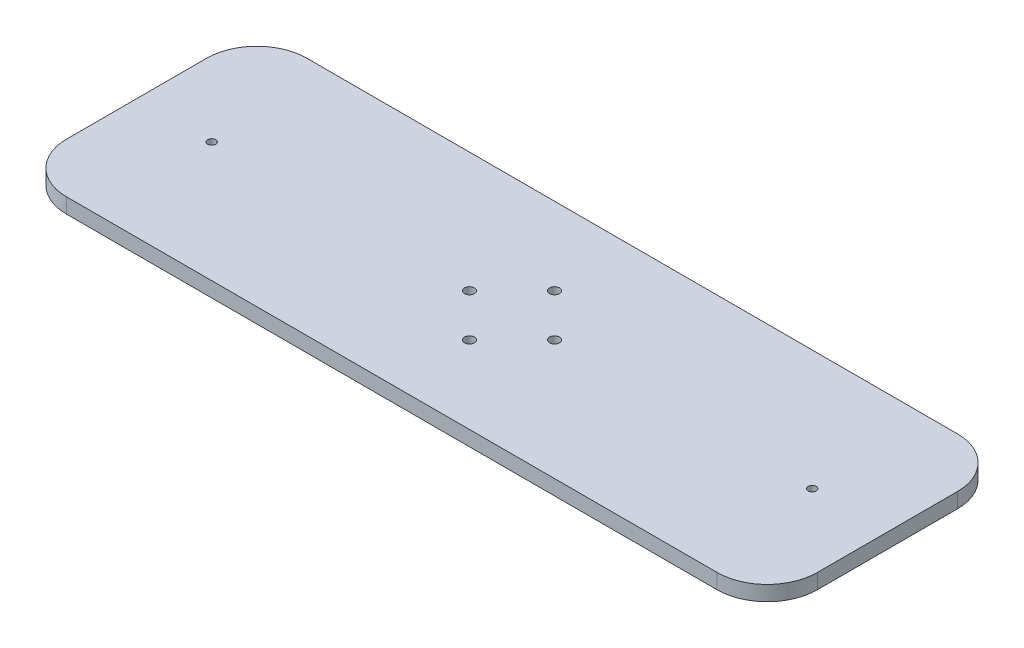
ISO-10303-21;
HEADER;
FILE_DESCRIPTION(('STEP AP214'),'2;1');
FILE_NAME('part.step','',(''),(''),'','','');
FILE_SCHEMA(('AUTOMOTIVE_DESIGN { 1 0 10303 214 1 1 1 1 }'));
ENDSEC;
DATA;
#1=APPLICATION_CONTEXT('core data for automotive mechanical design processes');
#2=APPLICATION_PROTOCOL_DEFINITION('international standard','automotive_design',2000,#1);
#3=PRODUCT_CONTEXT('',#1,'mechanical');
#4=PRODUCT('Part','Part','',(#3));
#5=PRODUCT_RELATED_PRODUCT_CATEGORY('part','',(#4));
#6=PRODUCT_DEFINITION_FORMATION('','',#4);
#7=PRODUCT_DEFINITION_CONTEXT('part definition',#1,'design');
#8=PRODUCT_DEFINITION('design','',#6,#7);
#9=PRODUCT_DEFINITION_SHAPE('','',#8);
#10=(LENGTH_UNIT() NAMED_UNIT(*) SI_UNIT(.MILLI.,.METRE.));
#11=(NAMED_UNIT(*) PLANE_ANGLE_UNIT() SI_UNIT($,.RADIAN.));
#12=(NAMED_UNIT(*) SI_UNIT($,.STERADIAN.) SOLID_ANGLE_UNIT());
#13=UNCERTAINTY_MEASURE_WITH_UNIT(LENGTH_MEASURE(1.E-05),#10,'distance_accuracy_value','');
#14=(GEOMETRIC_REPRESENTATION_CONTEXT(3) GLOBAL_UNCERTAINTY_ASSIGNED_CONTEXT((#13)) GLOBAL_UNIT_ASSIGNED_CONTEXT((#10,
#11,#12)) REPRESENTATION_CONTEXT('',''));
#15=CARTESIAN_POINT('',(0.,0.,0.));
#16=DIRECTION('',(0.,0.,1.));
#17=DIRECTION('',(1.,0.,0.));
#18=AXIS2_PLACEMENT_3D('',#15,#16,#17);
#19=CARTESIAN_POINT('',(-75.,3.,-24.));
#20=DIRECTION('',(1.,0.,0.));
#21=DIRECTION('',(0.,0.,-1.));
#22=AXIS2_PLACEMENT_3D('',#19,#20,#21);
#23=PLANE('',#22);
#24=DIRECTION('',(0.,0.,1.));
#25=VECTOR('',#24,1.);
#26=CARTESIAN_POINT('',(-75.,3.,-24.));
#27=LINE('',#26,#25);
#28=CARTESIAN_POINT('',(-75.,3.,-14.));
#29=VERTEX_POINT('',#28);
#30=CARTESIAN_POINT('',(-75.,3.,14.));
#31=VERTEX_POINT('',#30);
#32=EDGE_CURVE('E127',#29,#31,#27,.T.);
#33=ORIENTED_EDGE('',*,*,#32,.F.);
#34=DIRECTION('',(0.,-1.,0.));
#35=VECTOR('',#34,1.);
#36=CARTESIAN_POINT('',(-75.,3.,-14.));
#37=LINE('',#36,#35);
#38=CARTESIAN_POINT('',(-75.,0.,-14.));
#39=VERTEX_POINT('',#38);
#40=EDGE_CURVE('E11',#29,#39,#37,.T.);
#41=ORIENTED_EDGE('',*,*,#40,.T.);
#42=DIRECTION('',(0.,0.,1.));
#43=VECTOR('',#42,1.);
#44=CARTESIAN_POINT('',(-75.,0.,-24.));
#45=LINE('',#44,#43);
#46=CARTESIAN_POINT('',(-75.,0.,14.));
#47=VERTEX_POINT('',#46);
#48=EDGE_CURVE('E158',#39,#47,#45,.T.);
#49=ORIENTED_EDGE('',*,*,#48,.T.);
#50=DIRECTION('',(0.,-1.,0.));
#51=VECTOR('',#50,1.);
#52=CARTESIAN_POINT('',(-75.,3.,14.));
#53=LINE('',#52,#51);
#54=EDGE_CURVE('E41',#47,#31,#53,.F.);
#55=ORIENTED_EDGE('',*,*,#54,.T.);
#56=EDGE_LOOP('',(#33,#41,#49,#55));
#57=FACE_BOUND('',#56,.T.);
#58=ADVANCED_FACE('F33',(#57),#23,.F.);
#59=CARTESIAN_POINT('',(-75.,3.,24.));
#60=DIRECTION('',(0.,0.,-1.));
#61=DIRECTION('',(-1.,0.,0.));
#62=AXIS2_PLACEMENT_3D('',#59,#60,#61);
#63=PLANE('',#62);
#64=DIRECTION('',(1.,0.,0.));
#65=VECTOR('',#64,1.);
#66=CARTESIAN_POINT('',(-75.,0.,24.));
#67=LINE('',#66,#65);
#68=CARTESIAN_POINT('',(-65.,0.,24.));
#69=VERTEX_POINT('',#68);
#70=CARTESIAN_POINT('',(65.,0.,24.));
#71=VERTEX_POINT('',#70);
#72=EDGE_CURVE('E132',#69,#71,#67,.T.);
#73=ORIENTED_EDGE('',*,*,#72,.T.);
#74=DIRECTION('',(0.,-1.,0.));
#75=VECTOR('',#74,1.);
#76=CARTESIAN_POINT('',(65.,3.,24.));
#77=LINE('',#76,#75);
#78=CARTESIAN_POINT('',(65.,3.,24.));
#79=VERTEX_POINT('',#78);
#80=EDGE_CURVE('E48',#71,#79,#77,.F.);
#81=ORIENTED_EDGE('',*,*,#80,.T.);
#82=DIRECTION('',(1.,0.,0.));
#83=VECTOR('',#82,1.);
#84=CARTESIAN_POINT('',(-75.,3.,24.));
#85=LINE('',#84,#83);
#86=CARTESIAN_POINT('',(-65.,3.,24.));
#87=VERTEX_POINT('',#86);
#88=EDGE_CURVE('E130',#87,#79,#85,.T.);
#89=ORIENTED_EDGE('',*,*,#88,.F.);
#90=DIRECTION('',(0.,-1.,0.));
#91=VECTOR('',#90,1.);
#92=CARTESIAN_POINT('',(-65.,3.,24.));
#93=LINE('',#92,#91);
#94=EDGE_CURVE('E150',#87,#69,#93,.T.);
#95=ORIENTED_EDGE('',*,*,#94,.T.);
#96=EDGE_LOOP('',(#73,#81,#89,#95));
#97=FACE_BOUND('',#96,.T.);
#98=ADVANCED_FACE('F165',(#97),#63,.F.);
#99=CARTESIAN_POINT('',(75.,3.,-24.));
#100=DIRECTION('',(-1.,0.,0.));
#101=DIRECTION('',(0.,0.,1.));
#102=AXIS2_PLACEMENT_3D('',#99,#100,#101);
#103=PLANE('',#102);
#104=DIRECTION('',(0.,0.,-1.));
#105=VECTOR('',#104,1.);
#106=CARTESIAN_POINT('',(75.,0.,-24.));
#107=LINE('',#106,#105);
#108=CARTESIAN_POINT('',(75.,0.,14.));
#109=VERTEX_POINT('',#108);
#110=CARTESIAN_POINT('',(75.,0.,-14.));
#111=VERTEX_POINT('',#110);
#112=EDGE_CURVE('E128',#109,#111,#107,.T.);
#113=ORIENTED_EDGE('',*,*,#112,.T.);
#114=DIRECTION('',(0.,-1.,0.));
#115=VECTOR('',#114,1.);
#116=CARTESIAN_POINT('',(75.,3.,-14.));
#117=LINE('',#116,#115);
#118=CARTESIAN_POINT('',(75.,3.,-14.));
#119=VERTEX_POINT('',#118);
#120=EDGE_CURVE('E105',#111,#119,#117,.F.);
#121=ORIENTED_EDGE('',*,*,#120,.T.);
#122=DIRECTION('',(0.,0.,-1.));
#123=VECTOR('',#122,1.);
#124=CARTESIAN_POINT('',(75.,3.,-24.));
#125=LINE('',#124,#123);
#126=CARTESIAN_POINT('',(75.,3.,14.));
#127=VERTEX_POINT('',#126);
#128=EDGE_CURVE('E170',#127,#119,#125,.T.);
#129=ORIENTED_EDGE('',*,*,#128,.F.);
#130=DIRECTION('',(0.,-1.,0.));
#131=VECTOR('',#130,1.);
#132=CARTESIAN_POINT('',(75.,3.,14.));
#133=LINE('',#132,#131);
#134=EDGE_CURVE('E110',#127,#109,#133,.T.);
#135=ORIENTED_EDGE('',*,*,#134,.T.);
#136=EDGE_LOOP('',(#113,#121,#129,#135));
#137=FACE_BOUND('',#136,.T.);
#138=ADVANCED_FACE('F250',(#137),#103,.F.);
#139=CARTESIAN_POINT('',(-75.,3.,-24.));
#140=DIRECTION('',(0.,0.,1.));
#141=DIRECTION('',(1.,0.,0.));
#142=AXIS2_PLACEMENT_3D('',#139,#140,#141);
#143=PLANE('',#142);
#144=DIRECTION('',(-1.,0.,0.));
#145=VECTOR('',#144,1.);
#146=CARTESIAN_POINT('',(-75.,3.,-24.));
#147=LINE('',#146,#145);
#148=CARTESIAN_POINT('',(65.,3.,-24.));
#149=VERTEX_POINT('',#148);
#150=CARTESIAN_POINT('',(-65.,3.,-24.));
#151=VERTEX_POINT('',#150);
#152=EDGE_CURVE('E120',#149,#151,#147,.T.);
#153=ORIENTED_EDGE('',*,*,#152,.F.);
#154=DIRECTION('',(0.,-1.,0.));
#155=VECTOR('',#154,1.);
#156=CARTESIAN_POINT('',(65.,3.,-24.));
#157=LINE('',#156,#155);
#158=CARTESIAN_POINT('',(65.,0.,-24.));
#159=VERTEX_POINT('',#158);
#160=EDGE_CURVE('E104',#149,#159,#157,.T.);
#161=ORIENTED_EDGE('',*,*,#160,.T.);
#162=DIRECTION('',(-1.,0.,0.));
#163=VECTOR('',#162,1.);
#164=CARTESIAN_POINT('',(-75.,0.,-24.));
#165=LINE('',#164,#163);
#166=CARTESIAN_POINT('',(-65.,0.,-24.));
#167=VERTEX_POINT('',#166);
#168=EDGE_CURVE('E117',#159,#167,#165,.T.);
#169=ORIENTED_EDGE('',*,*,#168,.T.);
#170=DIRECTION('',(0.,-1.,0.));
#171=VECTOR('',#170,1.);
#172=CARTESIAN_POINT('',(-65.,3.,-24.));
#173=LINE('',#172,#171);
#174=EDGE_CURVE('E122',#167,#151,#173,.F.);
#175=ORIENTED_EDGE('',*,*,#174,.T.);
#176=EDGE_LOOP('',(#153,#161,#169,#175));
#177=FACE_BOUND('',#176,.T.);
#178=ADVANCED_FACE('F116',(#177),#143,.F.);
#179=CARTESIAN_POINT('',(0.,3.,0.));
#180=DIRECTION('',(0.,1.,0.));
#181=DIRECTION('',(0.,0.,1.));
#182=AXIS2_PLACEMENT_3D('',#179,#180,#181);
#183=PLANE('',#182);
#184=CARTESIAN_POINT('',(8.5,3.,0.));
#185=DIRECTION('',(0.,1.,0.));
#186=DIRECTION('',(0.,0.,1.));
#187=AXIS2_PLACEMENT_3D('',#184,#185,#186);
#188=CIRCLE('',#187,0.999999999999999);
#189=CARTESIAN_POINT('',(8.5,3.,0.999999999999969));
#190=VERTEX_POINT('',#189);
#191=EDGE_CURVE('E203',#190,#190,#188,.T.);
#192=ORIENTED_EDGE('',*,*,#191,.F.);
#193=EDGE_LOOP('',(#192));
#194=FACE_BOUND('',#193,.T.);
#195=CARTESIAN_POINT('',(-8.5,3.,0.));
#196=DIRECTION('',(0.,1.,0.));
#197=DIRECTION('',(0.,0.,1.));
#198=AXIS2_PLACEMENT_3D('',#195,#196,#197);
#199=CIRCLE('',#198,1.);
#200=CARTESIAN_POINT('',(-8.5,3.,1.00000000000003));
#201=VERTEX_POINT('',#200);
#202=EDGE_CURVE('E197',#201,#201,#199,.T.);
#203=ORIENTED_EDGE('',*,*,#202,.F.);
#204=EDGE_LOOP('',(#203));
#205=FACE_BOUND('',#204,.T.);
#206=CARTESIAN_POINT('',(0.,3.,8.5));
#207=DIRECTION('',(0.,1.,0.));
#208=DIRECTION('',(0.,0.,1.));
#209=AXIS2_PLACEMENT_3D('',#206,#207,#208);
#210=CIRCLE('',#209,1.);
#211=CARTESIAN_POINT('',(0.,3.,9.5));
#212=VERTEX_POINT('',#211);
#213=EDGE_CURVE('E191',#212,#212,#210,.T.);
#214=ORIENTED_EDGE('',*,*,#213,.F.);
#215=EDGE_LOOP('',(#214));
#216=FACE_BOUND('',#215,.T.);
#217=CARTESIAN_POINT('',(0.,3.,-8.5));
#218=DIRECTION('',(0.,1.,0.));
#219=DIRECTION('',(0.,0.,1.));
#220=AXIS2_PLACEMENT_3D('',#217,#218,#219);
#221=CIRCLE('',#220,1.);
#222=CARTESIAN_POINT('',(0.,3.,-7.5));
#223=VERTEX_POINT('',#222);
#224=EDGE_CURVE('E185',#223,#223,#221,.T.);
#225=ORIENTED_EDGE('',*,*,#224,.F.);
#226=EDGE_LOOP('',(#225));
#227=FACE_BOUND('',#226,.T.);
#228=CARTESIAN_POINT('',(60.,3.,0.));
#229=DIRECTION('',(0.,1.,0.));
#230=DIRECTION('',(0.,0.,1.));
#231=AXIS2_PLACEMENT_3D('',#228,#229,#230);
#232=CIRCLE('',#231,0.800000000000003);
#233=CARTESIAN_POINT('',(60.,3.,0.800000000000003));
#234=VERTEX_POINT('',#233);
#235=EDGE_CURVE('E179',#234,#234,#232,.T.);
#236=ORIENTED_EDGE('',*,*,#235,.F.);
#237=EDGE_LOOP('',(#236));
#238=FACE_BOUND('',#237,.T.);
#239=CARTESIAN_POINT('',(-60.,3.,0.));
#240=DIRECTION('',(0.,1.,0.));
#241=DIRECTION('',(0.,0.,1.));
#242=AXIS2_PLACEMENT_3D('',#239,#240,#241);
#243=CIRCLE('',#242,0.800000000000003);
#244=CARTESIAN_POINT('',(-60.,3.,0.80000000000001));
#245=VERTEX_POINT('',#244);
#246=EDGE_CURVE('E173',#245,#245,#243,.T.);
#247=ORIENTED_EDGE('',*,*,#246,.F.);
#248=EDGE_LOOP('',(#247));
#249=FACE_BOUND('',#248,.T.);
#250=ORIENTED_EDGE('',*,*,#128,.T.);
#251=CARTESIAN_POINT('',(65.,3.,-14.));
#252=DIRECTION('',(0.,1.,0.));
#253=DIRECTION('',(0.,0.,1.));
#254=AXIS2_PLACEMENT_3D('',#251,#252,#253);
#255=CIRCLE('',#254,10.);
#256=EDGE_CURVE('E148',#119,#149,#255,.T.);
#257=ORIENTED_EDGE('',*,*,#256,.T.);
#258=ORIENTED_EDGE('',*,*,#152,.T.);
#259=CARTESIAN_POINT('',(-65.,3.,-14.));
#260=DIRECTION('',(0.,1.,0.));
#261=DIRECTION('',(0.,0.,1.));
#262=AXIS2_PLACEMENT_3D('',#259,#260,#261);
#263=CIRCLE('',#262,10.);
#264=EDGE_CURVE('E144',#151,#29,#263,.T.);
#265=ORIENTED_EDGE('',*,*,#264,.T.);
#266=ORIENTED_EDGE('',*,*,#32,.T.);
#267=CARTESIAN_POINT('',(-65.,3.,14.));
#268=DIRECTION('',(0.,1.,0.));
#269=DIRECTION('',(0.,0.,1.));
#270=AXIS2_PLACEMENT_3D('',#267,#268,#269);
#271=CIRCLE('',#270,10.);
#272=EDGE_CURVE('E55',#31,#87,#271,.T.);
#273=ORIENTED_EDGE('',*,*,#272,.T.);
#274=ORIENTED_EDGE('',*,*,#88,.T.);
#275=CARTESIAN_POINT('',(65.,3.,14.));
#276=DIRECTION('',(0.,1.,0.));
#277=DIRECTION('',(0.,0.,1.));
#278=AXIS2_PLACEMENT_3D('',#275,#276,#277);
#279=CIRCLE('',#278,10.);
#280=EDGE_CURVE('E146',#79,#127,#279,.T.);
#281=ORIENTED_EDGE('',*,*,#280,.T.);
#282=EDGE_LOOP('',(#250,#257,#258,#265,#266,#273,#274,#281));
#283=FACE_BOUND('',#282,.T.);
#284=ADVANCED_FACE('F161',(#194,#205,#216,#227,#238,#249,#283),#183,.T.);
#285=CARTESIAN_POINT('',(0.,0.,0.));
#286=DIRECTION('',(0.,1.,0.));
#287=DIRECTION('',(0.,0.,1.));
#288=AXIS2_PLACEMENT_3D('',#285,#286,#287);
#289=PLANE('',#288);
#290=CARTESIAN_POINT('',(8.5,0.,0.));
#291=DIRECTION('',(0.,1.,0.));
#292=DIRECTION('',(0.,0.,1.));
#293=AXIS2_PLACEMENT_3D('',#290,#291,#292);
#294=CIRCLE('',#293,0.999999999999999);
#295=CARTESIAN_POINT('',(8.5,0.,0.999999999999969));
#296=VERTEX_POINT('',#295);
#297=EDGE_CURVE('E200',#296,#296,#294,.T.);
#298=ORIENTED_EDGE('',*,*,#297,.T.);
#299=EDGE_LOOP('',(#298));
#300=FACE_BOUND('',#299,.T.);
#301=CARTESIAN_POINT('',(-8.5,0.,0.));
#302=DIRECTION('',(0.,1.,0.));
#303=DIRECTION('',(0.,0.,1.));
#304=AXIS2_PLACEMENT_3D('',#301,#302,#303);
#305=CIRCLE('',#304,1.);
#306=CARTESIAN_POINT('',(-8.5,0.,1.00000000000003));
#307=VERTEX_POINT('',#306);
#308=EDGE_CURVE('E194',#307,#307,#305,.T.);
#309=ORIENTED_EDGE('',*,*,#308,.T.);
#310=EDGE_LOOP('',(#309));
#311=FACE_BOUND('',#310,.T.);
#312=CARTESIAN_POINT('',(0.,0.,8.5));
#313=DIRECTION('',(0.,1.,0.));
#314=DIRECTION('',(0.,0.,1.));
#315=AXIS2_PLACEMENT_3D('',#312,#313,#314);
#316=CIRCLE('',#315,1.);
#317=CARTESIAN_POINT('',(0.,0.,9.5));
#318=VERTEX_POINT('',#317);
#319=EDGE_CURVE('E188',#318,#318,#316,.T.);
#320=ORIENTED_EDGE('',*,*,#319,.T.);
#321=EDGE_LOOP('',(#320));
#322=FACE_BOUND('',#321,.T.);
#323=CARTESIAN_POINT('',(0.,0.,-8.5));
#324=DIRECTION('',(0.,1.,0.));
#325=DIRECTION('',(0.,0.,1.));
#326=AXIS2_PLACEMENT_3D('',#323,#324,#325);
#327=CIRCLE('',#326,1.);
#328=CARTESIAN_POINT('',(0.,0.,-7.5));
#329=VERTEX_POINT('',#328);
#330=EDGE_CURVE('E182',#329,#329,#327,.T.);
#331=ORIENTED_EDGE('',*,*,#330,.T.);
#332=EDGE_LOOP('',(#331));
#333=FACE_BOUND('',#332,.T.);
#334=CARTESIAN_POINT('',(60.,0.,0.));
#335=DIRECTION('',(0.,1.,0.));
#336=DIRECTION('',(0.,0.,1.));
#337=AXIS2_PLACEMENT_3D('',#334,#335,#336);
#338=CIRCLE('',#337,0.800000000000003);
#339=CARTESIAN_POINT('',(60.,0.,0.800000000000003));
#340=VERTEX_POINT('',#339);
#341=EDGE_CURVE('E176',#340,#340,#338,.T.);
#342=ORIENTED_EDGE('',*,*,#341,.T.);
#343=EDGE_LOOP('',(#342));
#344=FACE_BOUND('',#343,.T.);
#345=CARTESIAN_POINT('',(-60.,0.,0.));
#346=DIRECTION('',(0.,1.,0.));
#347=DIRECTION('',(0.,0.,1.));
#348=AXIS2_PLACEMENT_3D('',#345,#346,#347);
#349=CIRCLE('',#348,0.800000000000003);
#350=CARTESIAN_POINT('',(-60.,0.,0.80000000000001));
#351=VERTEX_POINT('',#350);
#352=EDGE_CURVE('E166',#351,#351,#349,.T.);
#353=ORIENTED_EDGE('',*,*,#352,.T.);
#354=EDGE_LOOP('',(#353));
#355=FACE_BOUND('',#354,.T.);
#356=ORIENTED_EDGE('',*,*,#168,.F.);
#357=CARTESIAN_POINT('',(65.,0.,-14.));
#358=DIRECTION('',(0.,1.,0.));
#359=DIRECTION('',(0.,0.,1.));
#360=AXIS2_PLACEMENT_3D('',#357,#358,#359);
#361=CIRCLE('',#360,10.);
#362=EDGE_CURVE('E100',#159,#111,#361,.F.);
#363=ORIENTED_EDGE('',*,*,#362,.T.);
#364=ORIENTED_EDGE('',*,*,#112,.F.);
#365=CARTESIAN_POINT('',(65.,0.,14.));
#366=DIRECTION('',(0.,1.,0.));
#367=DIRECTION('',(0.,0.,1.));
#368=AXIS2_PLACEMENT_3D('',#365,#366,#367);
#369=CIRCLE('',#368,10.);
#370=EDGE_CURVE('E111',#109,#71,#369,.F.);
#371=ORIENTED_EDGE('',*,*,#370,.T.);
#372=ORIENTED_EDGE('',*,*,#72,.F.);
#373=CARTESIAN_POINT('',(-65.,0.,14.));
#374=DIRECTION('',(0.,1.,0.));
#375=DIRECTION('',(0.,0.,1.));
#376=AXIS2_PLACEMENT_3D('',#373,#374,#375);
#377=CIRCLE('',#376,10.);
#378=EDGE_CURVE('E121',#69,#47,#377,.F.);
#379=ORIENTED_EDGE('',*,*,#378,.T.);
#380=ORIENTED_EDGE('',*,*,#48,.F.);
#381=CARTESIAN_POINT('',(-65.,0.,-14.));
#382=DIRECTION('',(0.,1.,0.));
#383=DIRECTION('',(0.,0.,1.));
#384=AXIS2_PLACEMENT_3D('',#381,#382,#383);
#385=CIRCLE('',#384,10.);
#386=EDGE_CURVE('E126',#39,#167,#385,.F.);
#387=ORIENTED_EDGE('',*,*,#386,.T.);
#388=EDGE_LOOP('',(#356,#363,#364,#371,#372,#379,#380,#387));
#389=FACE_BOUND('',#388,.T.);
#390=ADVANCED_FACE('F124',(#300,#311,#322,#333,#344,#355,#389),#289,.F.);
#391=CARTESIAN_POINT('',(65.,3.,-14.));
#392=DIRECTION('',(0.,-1.,0.));
#393=DIRECTION('',(0.,0.,-1.));
#394=AXIS2_PLACEMENT_3D('',#391,#392,#393);
#395=CYLINDRICAL_SURFACE('',#394,10.);
#396=ORIENTED_EDGE('',*,*,#256,.F.);
#397=ORIENTED_EDGE('',*,*,#120,.F.);
#398=ORIENTED_EDGE('',*,*,#362,.F.);
#399=ORIENTED_EDGE('',*,*,#160,.F.);
#400=EDGE_LOOP('',(#396,#397,#398,#399));
#401=FACE_BOUND('',#400,.T.);
#402=ADVANCED_FACE('F103',(#401),#395,.T.);
#403=CARTESIAN_POINT('',(65.,3.,14.));
#404=DIRECTION('',(0.,-1.,0.));
#405=DIRECTION('',(0.,0.,-1.));
#406=AXIS2_PLACEMENT_3D('',#403,#404,#405);
#407=CYLINDRICAL_SURFACE('',#406,10.);
#408=ORIENTED_EDGE('',*,*,#280,.F.);
#409=ORIENTED_EDGE('',*,*,#80,.F.);
#410=ORIENTED_EDGE('',*,*,#370,.F.);
#411=ORIENTED_EDGE('',*,*,#134,.F.);
#412=EDGE_LOOP('',(#408,#409,#410,#411));
#413=FACE_BOUND('',#412,.T.);
#414=ADVANCED_FACE('F256',(#413),#407,.T.);
#415=CARTESIAN_POINT('',(-65.,3.,-14.));
#416=DIRECTION('',(0.,-1.,0.));
#417=DIRECTION('',(0.,0.,-1.));
#418=AXIS2_PLACEMENT_3D('',#415,#416,#417);
#419=CYLINDRICAL_SURFACE('',#418,10.);
#420=ORIENTED_EDGE('',*,*,#264,.F.);
#421=ORIENTED_EDGE('',*,*,#174,.F.);
#422=ORIENTED_EDGE('',*,*,#386,.F.);
#423=ORIENTED_EDGE('',*,*,#40,.F.);
#424=EDGE_LOOP('',(#420,#421,#422,#423));
#425=FACE_BOUND('',#424,.T.);
#426=ADVANCED_FACE('F243',(#425),#419,.T.);
#427=CARTESIAN_POINT('',(-65.,3.,14.));
#428=DIRECTION('',(0.,-1.,0.));
#429=DIRECTION('',(0.,0.,-1.));
#430=AXIS2_PLACEMENT_3D('',#427,#428,#429);
#431=CYLINDRICAL_SURFACE('',#430,10.);
#432=ORIENTED_EDGE('',*,*,#272,.F.);
#433=ORIENTED_EDGE('',*,*,#54,.F.);
#434=ORIENTED_EDGE('',*,*,#378,.F.);
#435=ORIENTED_EDGE('',*,*,#94,.F.);
#436=EDGE_LOOP('',(#432,#433,#434,#435));
#437=FACE_BOUND('',#436,.T.);
#438=ADVANCED_FACE('F35',(#437),#431,.T.);
#439=CARTESIAN_POINT('',(-60.,0.,0.));
#440=DIRECTION('',(0.,1.,0.));
#441=DIRECTION('',(0.,0.,1.));
#442=AXIS2_PLACEMENT_3D('',#439,#440,#441);
#443=CYLINDRICAL_SURFACE('',#442,0.800000000000003);
#444=ORIENTED_EDGE('',*,*,#352,.F.);
#445=EDGE_LOOP('',(#444));
#446=FACE_BOUND('',#445,.T.);
#447=ORIENTED_EDGE('',*,*,#246,.T.);
#448=EDGE_LOOP('',(#447));
#449=FACE_BOUND('',#448,.T.);
#450=ADVANCED_FACE('F231',(#446,#449),#443,.F.);
#451=CARTESIAN_POINT('',(60.,0.,0.));
#452=DIRECTION('',(0.,1.,0.));
#453=DIRECTION('',(0.,0.,1.));
#454=AXIS2_PLACEMENT_3D('',#451,#452,#453);
#455=CYLINDRICAL_SURFACE('',#454,0.800000000000003);
#456=ORIENTED_EDGE('',*,*,#341,.F.);
#457=EDGE_LOOP('',(#456));
#458=FACE_BOUND('',#457,.T.);
#459=ORIENTED_EDGE('',*,*,#235,.T.);
#460=EDGE_LOOP('',(#459));
#461=FACE_BOUND('',#460,.T.);
#462=ADVANCED_FACE('F233',(#458,#461),#455,.F.);
#463=CARTESIAN_POINT('',(0.,0.,-8.5));
#464=DIRECTION('',(0.,1.,0.));
#465=DIRECTION('',(0.,0.,1.));
#466=AXIS2_PLACEMENT_3D('',#463,#464,#465);
#467=CYLINDRICAL_SURFACE('',#466,1.);
#468=ORIENTED_EDGE('',*,*,#330,.F.);
#469=EDGE_LOOP('',(#468));
#470=FACE_BOUND('',#469,.T.);
#471=ORIENTED_EDGE('',*,*,#224,.T.);
#472=EDGE_LOOP('',(#471));
#473=FACE_BOUND('',#472,.T.);
#474=ADVANCED_FACE('F240',(#470,#473),#467,.F.);
#475=CARTESIAN_POINT('',(0.,0.,8.5));
#476=DIRECTION('',(0.,1.,0.));
#477=DIRECTION('',(0.,0.,1.));
#478=AXIS2_PLACEMENT_3D('',#475,#476,#477);
#479=CYLINDRICAL_SURFACE('',#478,1.);
#480=ORIENTED_EDGE('',*,*,#319,.F.);
#481=EDGE_LOOP('',(#480));
#482=FACE_BOUND('',#481,.T.);
#483=ORIENTED_EDGE('',*,*,#213,.T.);
#484=EDGE_LOOP('',(#483));
#485=FACE_BOUND('',#484,.T.);
#486=ADVANCED_FACE('F286',(#482,#485),#479,.F.);
#487=CARTESIAN_POINT('',(-8.5,0.,0.));
#488=DIRECTION('',(0.,1.,0.));
#489=DIRECTION('',(0.,0.,1.));
#490=AXIS2_PLACEMENT_3D('',#487,#488,#489);
#491=CYLINDRICAL_SURFACE('',#490,1.);
#492=ORIENTED_EDGE('',*,*,#308,.F.);
#493=EDGE_LOOP('',(#492));
#494=FACE_BOUND('',#493,.T.);
#495=ORIENTED_EDGE('',*,*,#202,.T.);
#496=EDGE_LOOP('',(#495));
#497=FACE_BOUND('',#496,.T.);
#498=ADVANCED_FACE('F214',(#494,#497),#491,.F.);
#499=CARTESIAN_POINT('',(8.5,0.,0.));
#500=DIRECTION('',(0.,1.,0.));
#501=DIRECTION('',(0.,0.,1.));
#502=AXIS2_PLACEMENT_3D('',#499,#500,#501);
#503=CYLINDRICAL_SURFACE('',#502,0.999999999999999);
#504=ORIENTED_EDGE('',*,*,#297,.F.);
#505=EDGE_LOOP('',(#504));
#506=FACE_BOUND('',#505,.T.);
#507=ORIENTED_EDGE('',*,*,#191,.T.);
#508=EDGE_LOOP('',(#507));
#509=FACE_BOUND('',#508,.T.);
#510=ADVANCED_FACE('F211',(#506,#509),#503,.F.);
#511=CLOSED_SHELL('',(#58,#98,#138,#178,#284,#390,#402,#414,#426,#438,#450,#462,#474,#486,#498,#510));
#512=MANIFOLD_SOLID_BREP('B2',#511);
#513=ADVANCED_BREP_SHAPE_REPRESENTATION('',(#18,#512),#14);
#514=SHAPE_DEFINITION_REPRESENTATION(#9,#513);
ENDSEC;
END-ISO-10303-21;
